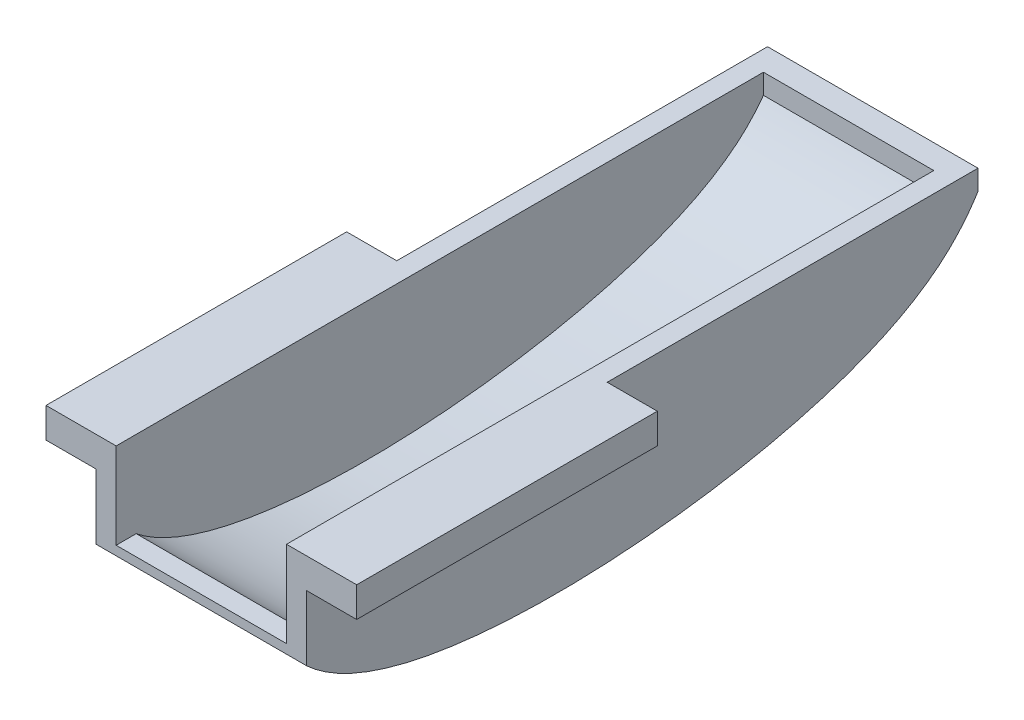
ISO-10303-21;
HEADER;
FILE_DESCRIPTION(('STEP AP214'),'2;1');
FILE_NAME('part.step','',(''),(''),'','','');
FILE_SCHEMA(('AUTOMOTIVE_DESIGN { 1 0 10303 214 1 1 1 1 }'));
ENDSEC;
DATA;
#1=APPLICATION_CONTEXT('core data for automotive mechanical design processes');
#2=APPLICATION_PROTOCOL_DEFINITION('international standard','automotive_design',2000,#1);
#3=PRODUCT_CONTEXT('',#1,'mechanical');
#4=PRODUCT('Part','Part','',(#3));
#5=PRODUCT_RELATED_PRODUCT_CATEGORY('part','',(#4));
#6=PRODUCT_DEFINITION_FORMATION('','',#4);
#7=PRODUCT_DEFINITION_CONTEXT('part definition',#1,'design');
#8=PRODUCT_DEFINITION('design','',#6,#7);
#9=PRODUCT_DEFINITION_SHAPE('','',#8);
#10=(LENGTH_UNIT() NAMED_UNIT(*) SI_UNIT(.MILLI.,.METRE.));
#11=(NAMED_UNIT(*) PLANE_ANGLE_UNIT() SI_UNIT($,.RADIAN.));
#12=(NAMED_UNIT(*) SI_UNIT($,.STERADIAN.) SOLID_ANGLE_UNIT());
#13=UNCERTAINTY_MEASURE_WITH_UNIT(LENGTH_MEASURE(1.E-05),#10,'distance_accuracy_value','');
#14=(GEOMETRIC_REPRESENTATION_CONTEXT(3) GLOBAL_UNCERTAINTY_ASSIGNED_CONTEXT((#13)) GLOBAL_UNIT_ASSIGNED_CONTEXT((#10,
#11,#12)) REPRESENTATION_CONTEXT('',''));
#15=CARTESIAN_POINT('',(0.,0.,0.));
#16=DIRECTION('',(0.,0.,1.));
#17=DIRECTION('',(1.,0.,0.));
#18=AXIS2_PLACEMENT_3D('',#15,#16,#17);
#19=CARTESIAN_POINT('',(10.5,-13.046875,30.375));
#20=DIRECTION('',(1.,0.,0.));
#21=DIRECTION('',(0.,0.,-1.));
#22=AXIS2_PLACEMENT_3D('',#19,#20,#21);
#23=PLANE('',#22);
#24=DIRECTION('',(0.,0.,1.));
#25=VECTOR('',#24,1.);
#26=CARTESIAN_POINT('',(10.5,2.00000000000028,2.40991752715528));
#27=LINE('',#26,#25);
#28=CARTESIAN_POINT('',(10.5,2.00000000000028,0.));
#29=VERTEX_POINT('',#28);
#30=CARTESIAN_POINT('',(10.5,2.00000000000028,37.));
#31=VERTEX_POINT('',#30);
#32=EDGE_CURVE('E162',#29,#31,#27,.T.);
#33=ORIENTED_EDGE('',*,*,#32,.T.);
#34=DIRECTION('',(0.,-1.,0.));
#35=VECTOR('',#34,1.);
#36=CARTESIAN_POINT('',(10.5,-0.999999999999722,37.));
#37=LINE('',#36,#35);
#38=CARTESIAN_POINT('',(10.5,-0.999999999999722,37.));
#39=VERTEX_POINT('',#38);
#40=EDGE_CURVE('E154',#31,#39,#37,.T.);
#41=ORIENTED_EDGE('',*,*,#40,.T.);
#42=DIRECTION('',(0.,0.,1.));
#43=VECTOR('',#42,1.);
#44=CARTESIAN_POINT('',(10.5,-0.999999999999722,37.));
#45=LINE('',#44,#43);
#46=CARTESIAN_POINT('',(10.5,-0.999999999999722,67.));
#47=VERTEX_POINT('',#46);
#48=EDGE_CURVE('E140',#39,#47,#45,.T.);
#49=ORIENTED_EDGE('',*,*,#48,.T.);
#50=DIRECTION('',(0.,-1.,0.));
#51=VECTOR('',#50,1.);
#52=CARTESIAN_POINT('',(10.5,-7.5,67.));
#53=LINE('',#52,#51);
#54=CARTESIAN_POINT('',(10.5,-7.5,67.));
#55=VERTEX_POINT('',#54);
#56=EDGE_CURVE('E246',#47,#55,#53,.T.);
#57=ORIENTED_EDGE('',*,*,#56,.T.);
#58=CARTESIAN_POINT('',(10.5,-7.5,67.));
#59=CARTESIAN_POINT('',(10.5,-14.,60.));
#60=CARTESIAN_POINT('',(10.5,-17.,44.));
#61=CARTESIAN_POINT('',(10.5,-13.,14.));
#62=CARTESIAN_POINT('',(10.5,-8.,5.));
#63=CARTESIAN_POINT('',(10.5,0.,0.));
#64=B_SPLINE_CURVE_WITH_KNOTS('',5,(#58,#59,#60,#61,#62,#63),.UNSPECIFIED.,.F.,.F.,(6,6),(0.,
1.),.UNSPECIFIED.);
#65=CARTESIAN_POINT('',(10.5,0.,0.));
#66=VERTEX_POINT('',#65);
#67=EDGE_CURVE('E235',#55,#66,#64,.T.);
#68=ORIENTED_EDGE('',*,*,#67,.T.);
#69=DIRECTION('',(0.,1.,0.));
#70=VECTOR('',#69,1.);
#71=CARTESIAN_POINT('',(10.5,2.00000000000028,0.));
#72=LINE('',#71,#70);
#73=EDGE_CURVE('E240',#66,#29,#72,.T.);
#74=ORIENTED_EDGE('',*,*,#73,.T.);
#75=EDGE_LOOP('',(#33,#41,#49,#57,#68,#74));
#76=FACE_BOUND('',#75,.T.);
#77=ADVANCED_FACE('F32',(#76),#23,.T.);
#78=CARTESIAN_POINT('',(-10.5,-13.046875,30.375));
#79=DIRECTION('',(1.,0.,0.));
#80=DIRECTION('',(0.,0.,-1.));
#81=AXIS2_PLACEMENT_3D('',#78,#79,#80);
#82=PLANE('',#81);
#83=DIRECTION('',(0.,0.,1.));
#84=VECTOR('',#83,1.);
#85=CARTESIAN_POINT('',(-10.5,-0.999999999999724,37.));
#86=LINE('',#85,#84);
#87=CARTESIAN_POINT('',(-10.5,-0.999999999999724,37.));
#88=VERTEX_POINT('',#87);
#89=CARTESIAN_POINT('',(-10.5,-0.999999999999724,67.));
#90=VERTEX_POINT('',#89);
#91=EDGE_CURVE('E191',#88,#90,#86,.T.);
#92=ORIENTED_EDGE('',*,*,#91,.F.);
#93=DIRECTION('',(0.,1.,0.));
#94=VECTOR('',#93,1.);
#95=CARTESIAN_POINT('',(-10.5,2.00000000000028,37.));
#96=LINE('',#95,#94);
#97=CARTESIAN_POINT('',(-10.5,2.00000000000028,37.));
#98=VERTEX_POINT('',#97);
#99=EDGE_CURVE('E176',#88,#98,#96,.T.);
#100=ORIENTED_EDGE('',*,*,#99,.T.);
#101=DIRECTION('',(0.,0.,1.));
#102=VECTOR('',#101,1.);
#103=CARTESIAN_POINT('',(-10.5,2.00000000000028,2.40991752715528));
#104=LINE('',#103,#102);
#105=CARTESIAN_POINT('',(-10.5,2.00000000000028,0.));
#106=VERTEX_POINT('',#105);
#107=EDGE_CURVE('E259',#106,#98,#104,.T.);
#108=ORIENTED_EDGE('',*,*,#107,.F.);
#109=DIRECTION('',(0.,1.,0.));
#110=VECTOR('',#109,1.);
#111=CARTESIAN_POINT('',(-10.5,2.00000000000028,0.));
#112=LINE('',#111,#110);
#113=CARTESIAN_POINT('',(-10.5,0.,0.));
#114=VERTEX_POINT('',#113);
#115=EDGE_CURVE('E253',#114,#106,#112,.T.);
#116=ORIENTED_EDGE('',*,*,#115,.F.);
#117=CARTESIAN_POINT('',(-10.5,-7.5,67.));
#118=CARTESIAN_POINT('',(-10.5,-14.,60.));
#119=CARTESIAN_POINT('',(-10.5,-17.,44.));
#120=CARTESIAN_POINT('',(-10.5,-13.,14.));
#121=CARTESIAN_POINT('',(-10.5,-8.,5.));
#122=CARTESIAN_POINT('',(-10.5,0.,0.));
#123=B_SPLINE_CURVE_WITH_KNOTS('',5,(#117,#118,#119,#120,#121,#122),.UNSPECIFIED.,.F.,.F.,(6,6),
(0.,1.),.UNSPECIFIED.);
#124=CARTESIAN_POINT('',(-10.5,-7.5,67.));
#125=VERTEX_POINT('',#124);
#126=EDGE_CURVE('E247',#125,#114,#123,.T.);
#127=ORIENTED_EDGE('',*,*,#126,.F.);
#128=DIRECTION('',(0.,-1.,0.));
#129=VECTOR('',#128,1.);
#130=CARTESIAN_POINT('',(-10.5,-7.5,67.));
#131=LINE('',#130,#129);
#132=EDGE_CURVE('E262',#90,#125,#131,.T.);
#133=ORIENTED_EDGE('',*,*,#132,.F.);
#134=EDGE_LOOP('',(#92,#100,#108,#116,#127,#133));
#135=FACE_BOUND('',#134,.T.);
#136=ADVANCED_FACE('F298',(#135),#82,.F.);
#137=CARTESIAN_POINT('',(-10.5,-6.58541733028586,65.));
#138=DIRECTION('',(0.,1.,0.));
#139=DIRECTION('',(0.,0.,1.));
#140=AXIS2_PLACEMENT_3D('',#137,#138,#139);
#141=PLANE('',#140);
#142=DIRECTION('',(1.,0.,0.));
#143=VECTOR('',#142,1.);
#144=CARTESIAN_POINT('',(-10.5,-6.58541733028586,67.));
#145=LINE('',#144,#143);
#146=CARTESIAN_POINT('',(-8.5,-6.58541733028586,67.));
#147=VERTEX_POINT('',#146);
#148=CARTESIAN_POINT('',(8.5,-6.58541733028586,67.));
#149=VERTEX_POINT('',#148);
#150=EDGE_CURVE('E42',#147,#149,#145,.T.);
#151=ORIENTED_EDGE('',*,*,#150,.T.);
#152=DIRECTION('',(0.,0.,-1.));
#153=VECTOR('',#152,1.);
#154=CARTESIAN_POINT('',(8.5,-6.58541733028586,65.));
#155=LINE('',#154,#153);
#156=CARTESIAN_POINT('',(8.49999999999999,-6.58541733028586,65.));
#157=VERTEX_POINT('',#156);
#158=EDGE_CURVE('E211',#149,#157,#155,.T.);
#159=ORIENTED_EDGE('',*,*,#158,.T.);
#160=DIRECTION('',(1.,0.,0.));
#161=VECTOR('',#160,1.);
#162=CARTESIAN_POINT('',(-10.5,-6.58541733028586,65.));
#163=LINE('',#162,#161);
#164=CARTESIAN_POINT('',(-8.5,-6.58541733028586,65.));
#165=VERTEX_POINT('',#164);
#166=EDGE_CURVE('E329',#165,#157,#163,.T.);
#167=ORIENTED_EDGE('',*,*,#166,.F.);
#168=DIRECTION('',(0.,0.,1.));
#169=VECTOR('',#168,1.);
#170=CARTESIAN_POINT('',(-8.5,-6.58541733028586,65.));
#171=LINE('',#170,#169);
#172=EDGE_CURVE('E230',#165,#147,#171,.T.);
#173=ORIENTED_EDGE('',*,*,#172,.T.);
#174=EDGE_LOOP('',(#151,#159,#167,#173));
#175=FACE_BOUND('',#174,.T.);
#176=ADVANCED_FACE('F276',(#175),#141,.T.);
#177=CARTESIAN_POINT('',(-10.5,1.05969013823158,1.69556016571188));
#178=CARTESIAN_POINT('',(-10.5,0.326468374083647,2.15382949062016));
#179=CARTESIAN_POINT('',(-10.5,-1.06829617807532,3.16044090071315));
#180=CARTESIAN_POINT('',(-10.5,-3.57411888475472,5.718312008346));
#181=CARTESIAN_POINT('',(-10.5,-6.43576100075407,10.4976857034237));
#182=CARTESIAN_POINT('',(-10.5,-9.23382079752525,19.0374388766017));
#183=CARTESIAN_POINT('',(-10.5,-11.1364315280221,29.5720475329086));
#184=CARTESIAN_POINT('',(-10.5,-11.7993859953844,38.9666765556865));
#185=CARTESIAN_POINT('',(-10.5,-11.6937557642379,46.135832890669));
#186=CARTESIAN_POINT('',(-10.5,-11.2863118300239,51.1667034980007));
#187=CARTESIAN_POINT('',(-10.5,-10.5490344311225,55.693282116091));
#188=CARTESIAN_POINT('',(-10.5,-9.67188280200554,58.9320013956317));
#189=CARTESIAN_POINT('',(-10.5,-8.82973839544355,61.1570857059076));
#190=CARTESIAN_POINT('',(-10.5,-8.13783828860439,62.6339101824341));
#191=CARTESIAN_POINT('',(-10.5,-7.38227890242257,63.9314616852654));
#192=CARTESIAN_POINT('',(-10.5,-6.86938762757851,64.6457710080204));
#193=CARTESIAN_POINT('',(-10.5,-6.58541733028586,65.));
#194=B_SPLINE_CURVE_WITH_KNOTS('',3,(#177,#178,#179,#180,#181,#182,#183,#184,#185,#186,#187,
#188,#189,#190,#191,#192,#193),.UNSPECIFIED.,.F.,.F.,(4,1,1,1,1,1,1,1,1,1,1,1,1,1,4),(0.,
0.0612295232460904,0.122459046492181,0.244918092984361,0.367377139476542,0.489836185968723,
0.612295232460904,0.673524755706994,0.734754278953084,0.795983802199175,0.857213325445265,
0.88782808706831,0.918442848691355,0.949057610314401,0.979672371937446),.UNSPECIFIED.);
#195=DIRECTION('',(1.,0.,0.));
#196=VECTOR('',#195,1.);
#197=SURFACE_OF_LINEAR_EXTRUSION('',#194,#196);
#198=ORIENTED_EDGE('',*,*,#166,.T.);
#199=CARTESIAN_POINT('',(8.49999999999999,1.05969013823158,1.69556016571188));
#200=CARTESIAN_POINT('',(8.49999999999999,0.326468374083647,2.15382949062016));
#201=CARTESIAN_POINT('',(8.49999999999999,-1.06829617807532,3.16044090071315));
#202=CARTESIAN_POINT('',(8.49999999999999,-3.57411888475472,5.718312008346));
#203=CARTESIAN_POINT('',(8.49999999999999,-6.43576100075407,10.4976857034237));
#204=CARTESIAN_POINT('',(8.49999999999999,-9.23382079752525,19.0374388766017));
#205=CARTESIAN_POINT('',(8.49999999999999,-11.1364315280221,29.5720475329086));
#206=CARTESIAN_POINT('',(8.49999999999999,-11.7993859953844,38.9666765556865));
#207=CARTESIAN_POINT('',(8.49999999999999,-11.6937557642379,46.135832890669));
#208=CARTESIAN_POINT('',(8.49999999999999,-11.2863118300239,51.1667034980007));
#209=CARTESIAN_POINT('',(8.49999999999999,-10.5490344311225,55.693282116091));
#210=CARTESIAN_POINT('',(8.49999999999999,-9.67188280200554,58.9320013956317));
#211=CARTESIAN_POINT('',(8.49999999999999,-8.82973839544355,61.1570857059076));
#212=CARTESIAN_POINT('',(8.49999999999999,-8.13783828860439,62.6339101824341));
#213=CARTESIAN_POINT('',(8.49999999999999,-7.38227890242257,63.9314616852654));
#214=CARTESIAN_POINT('',(8.49999999999999,-6.86938762757851,64.6457710080204));
#215=CARTESIAN_POINT('',(8.49999999999999,-6.58541733028586,65.));
#216=B_SPLINE_CURVE_WITH_KNOTS('',3,(#199,#200,#201,#202,#203,#204,#205,#206,#207,#208,#209,
#210,#211,#212,#213,#214,#215),.UNSPECIFIED.,.F.,.F.,(4,1,1,1,1,1,1,1,1,1,1,1,1,1,4),(0.,
0.0612295232460904,0.122459046492181,0.244918092984361,0.367377139476542,0.489836185968723,
0.612295232460904,0.673524755706994,0.734754278953084,0.795983802199175,0.857213325445265,
0.88782808706831,0.918442848691355,0.949057610314401,0.979672371937446),.UNSPECIFIED.);
#217=CARTESIAN_POINT('',(8.5,0.,2.40991752715547));
#218=VERTEX_POINT('',#217);
#219=EDGE_CURVE('E206',#157,#218,#216,.F.);
#220=ORIENTED_EDGE('',*,*,#219,.T.);
#221=DIRECTION('',(1.,0.,0.));
#222=VECTOR('',#221,1.);
#223=CARTESIAN_POINT('',(-10.5,0.,2.40991752715547));
#224=LINE('',#223,#222);
#225=CARTESIAN_POINT('',(-8.5,0.,2.40991752715547));
#226=VERTEX_POINT('',#225);
#227=EDGE_CURVE('E322',#226,#218,#224,.T.);
#228=ORIENTED_EDGE('',*,*,#227,.F.);
#229=CARTESIAN_POINT('',(-8.5,1.05969013823158,1.69556016571188));
#230=CARTESIAN_POINT('',(-8.5,0.326468374083647,2.15382949062016));
#231=CARTESIAN_POINT('',(-8.5,-1.06829617807532,3.16044090071315));
#232=CARTESIAN_POINT('',(-8.5,-3.57411888475472,5.718312008346));
#233=CARTESIAN_POINT('',(-8.5,-6.43576100075407,10.4976857034237));
#234=CARTESIAN_POINT('',(-8.5,-9.23382079752525,19.0374388766017));
#235=CARTESIAN_POINT('',(-8.5,-11.1364315280221,29.5720475329086));
#236=CARTESIAN_POINT('',(-8.5,-11.7993859953844,38.9666765556865));
#237=CARTESIAN_POINT('',(-8.5,-11.6937557642379,46.135832890669));
#238=CARTESIAN_POINT('',(-8.5,-11.2863118300239,51.1667034980007));
#239=CARTESIAN_POINT('',(-8.5,-10.5490344311225,55.693282116091));
#240=CARTESIAN_POINT('',(-8.5,-9.67188280200554,58.9320013956317));
#241=CARTESIAN_POINT('',(-8.5,-8.82973839544355,61.1570857059076));
#242=CARTESIAN_POINT('',(-8.5,-8.13783828860439,62.6339101824341));
#243=CARTESIAN_POINT('',(-8.5,-7.38227890242257,63.9314616852654));
#244=CARTESIAN_POINT('',(-8.5,-6.86938762757851,64.6457710080204));
#245=CARTESIAN_POINT('',(-8.5,-6.58541733028586,65.));
#246=B_SPLINE_CURVE_WITH_KNOTS('',3,(#229,#230,#231,#232,#233,#234,#235,#236,#237,#238,#239,
#240,#241,#242,#243,#244,#245),.UNSPECIFIED.,.F.,.F.,(4,1,1,1,1,1,1,1,1,1,1,1,1,1,4),(0.,
0.0612295232460904,0.122459046492181,0.244918092984361,0.367377139476542,0.489836185968723,
0.612295232460904,0.673524755706994,0.734754278953084,0.795983802199175,0.857213325445265,
0.88782808706831,0.918442848691355,0.949057610314401,0.979672371937446),.UNSPECIFIED.);
#247=EDGE_CURVE('E226',#226,#165,#246,.T.);
#248=ORIENTED_EDGE('',*,*,#247,.T.);
#249=EDGE_LOOP('',(#198,#220,#228,#248));
#250=FACE_BOUND('',#249,.T.);
#251=ADVANCED_FACE('F271',(#250),#197,.T.);
#252=CARTESIAN_POINT('',(-10.5,0.,2.40991752715547));
#253=DIRECTION('',(0.,0.,1.));
#254=DIRECTION('',(0.,-1.,0.));
#255=AXIS2_PLACEMENT_3D('',#252,#253,#254);
#256=PLANE('',#255);
#257=ORIENTED_EDGE('',*,*,#227,.T.);
#258=DIRECTION('',(0.,1.,0.));
#259=VECTOR('',#258,1.);
#260=CARTESIAN_POINT('',(8.5,0.,2.40991752715547));
#261=LINE('',#260,#259);
#262=CARTESIAN_POINT('',(8.5,2.00000000000028,2.40991752715528));
#263=VERTEX_POINT('',#262);
#264=EDGE_CURVE('E203',#218,#263,#261,.T.);
#265=ORIENTED_EDGE('',*,*,#264,.T.);
#266=DIRECTION('',(1.,0.,0.));
#267=VECTOR('',#266,1.);
#268=CARTESIAN_POINT('',(-10.5,2.00000000000028,2.40991752715528));
#269=LINE('',#268,#267);
#270=CARTESIAN_POINT('',(-8.5,2.00000000000028,2.40991752715528));
#271=VERTEX_POINT('',#270);
#272=EDGE_CURVE('E319',#271,#263,#269,.T.);
#273=ORIENTED_EDGE('',*,*,#272,.F.);
#274=DIRECTION('',(0.,-1.,0.));
#275=VECTOR('',#274,1.);
#276=CARTESIAN_POINT('',(-8.5,0.,2.40991752715547));
#277=LINE('',#276,#275);
#278=EDGE_CURVE('E224',#271,#226,#277,.T.);
#279=ORIENTED_EDGE('',*,*,#278,.T.);
#280=EDGE_LOOP('',(#257,#265,#273,#279));
#281=FACE_BOUND('',#280,.T.);
#282=ADVANCED_FACE('F275',(#281),#256,.T.);
#283=DIRECTION('',(1.,0.,0.));
#284=VECTOR('',#283,1.);
#285=SURFACE_OF_LINEAR_EXTRUSION('',#123,#284);
#286=ORIENTED_EDGE('',*,*,#67,.F.);
#287=DIRECTION('',(1.,0.,0.));
#288=VECTOR('',#287,1.);
#289=CARTESIAN_POINT('',(-10.5,-7.5,67.));
#290=LINE('',#289,#288);
#291=EDGE_CURVE('E11',#125,#55,#290,.T.);
#292=ORIENTED_EDGE('',*,*,#291,.F.);
#293=ORIENTED_EDGE('',*,*,#126,.T.);
#294=DIRECTION('',(1.,0.,0.));
#295=VECTOR('',#294,1.);
#296=CARTESIAN_POINT('',(-10.5,0.,0.));
#297=LINE('',#296,#295);
#298=EDGE_CURVE('E315',#114,#66,#297,.T.);
#299=ORIENTED_EDGE('',*,*,#298,.T.);
#300=EDGE_LOOP('',(#286,#292,#293,#299));
#301=FACE_BOUND('',#300,.T.);
#302=ADVANCED_FACE('F34',(#301),#285,.T.);
#303=CARTESIAN_POINT('',(-10.5,-7.5,67.));
#304=DIRECTION('',(0.,0.,1.));
#305=DIRECTION('',(1.,0.,0.));
#306=AXIS2_PLACEMENT_3D('',#303,#304,#305);
#307=PLANE('',#306);
#308=ORIENTED_EDGE('',*,*,#56,.F.);
#309=DIRECTION('',(1.,0.,0.));
#310=VECTOR('',#309,1.);
#311=CARTESIAN_POINT('',(10.5,-0.999999999999722,67.));
#312=LINE('',#311,#310);
#313=CARTESIAN_POINT('',(15.5,-0.999999999999721,67.));
#314=VERTEX_POINT('',#313);
#315=EDGE_CURVE('E49',#47,#314,#312,.T.);
#316=ORIENTED_EDGE('',*,*,#315,.T.);
#317=DIRECTION('',(0.,1.,0.));
#318=VECTOR('',#317,1.);
#319=CARTESIAN_POINT('',(15.5,-0.999999999999721,67.));
#320=LINE('',#319,#318);
#321=CARTESIAN_POINT('',(15.5,2.00000000000028,67.));
#322=VERTEX_POINT('',#321);
#323=EDGE_CURVE('E163',#314,#322,#320,.T.);
#324=ORIENTED_EDGE('',*,*,#323,.T.);
#325=DIRECTION('',(1.,0.,0.));
#326=VECTOR('',#325,1.);
#327=CARTESIAN_POINT('',(8.5,2.00000000000028,67.));
#328=LINE('',#327,#326);
#329=CARTESIAN_POINT('',(8.5,2.00000000000028,67.));
#330=VERTEX_POINT('',#329);
#331=EDGE_CURVE('E201',#330,#322,#328,.T.);
#332=ORIENTED_EDGE('',*,*,#331,.F.);
#333=DIRECTION('',(0.,1.,0.));
#334=VECTOR('',#333,1.);
#335=CARTESIAN_POINT('',(8.5,-7.5,67.));
#336=LINE('',#335,#334);
#337=EDGE_CURVE('E199',#149,#330,#336,.T.);
#338=ORIENTED_EDGE('',*,*,#337,.F.);
#339=ORIENTED_EDGE('',*,*,#150,.F.);
#340=DIRECTION('',(0.,1.,0.));
#341=VECTOR('',#340,1.);
#342=CARTESIAN_POINT('',(-8.5,-7.5,67.));
#343=LINE('',#342,#341);
#344=CARTESIAN_POINT('',(-8.5,2.00000000000028,67.));
#345=VERTEX_POINT('',#344);
#346=EDGE_CURVE('E217',#147,#345,#343,.T.);
#347=ORIENTED_EDGE('',*,*,#346,.T.);
#348=DIRECTION('',(-1.,0.,0.));
#349=VECTOR('',#348,1.);
#350=CARTESIAN_POINT('',(-8.5,2.00000000000028,67.));
#351=LINE('',#350,#349);
#352=CARTESIAN_POINT('',(-15.5,2.00000000000028,67.));
#353=VERTEX_POINT('',#352);
#354=EDGE_CURVE('E222',#345,#353,#351,.T.);
#355=ORIENTED_EDGE('',*,*,#354,.T.);
#356=DIRECTION('',(0.,-1.,0.));
#357=VECTOR('',#356,1.);
#358=CARTESIAN_POINT('',(-15.5,2.00000000000028,67.));
#359=LINE('',#358,#357);
#360=CARTESIAN_POINT('',(-15.5,-0.999999999999725,67.));
#361=VERTEX_POINT('',#360);
#362=EDGE_CURVE('E174',#353,#361,#359,.T.);
#363=ORIENTED_EDGE('',*,*,#362,.T.);
#364=DIRECTION('',(1.,0.,0.));
#365=VECTOR('',#364,1.);
#366=CARTESIAN_POINT('',(-10.5,-0.999999999999724,67.));
#367=LINE('',#366,#365);
#368=EDGE_CURVE('E178',#361,#90,#367,.T.);
#369=ORIENTED_EDGE('',*,*,#368,.T.);
#370=ORIENTED_EDGE('',*,*,#132,.T.);
#371=ORIENTED_EDGE('',*,*,#291,.T.);
#372=EDGE_LOOP('',(#308,#316,#324,#332,#338,#339,#347,#355,#363,#369,#370,#371));
#373=FACE_BOUND('',#372,.T.);
#374=ADVANCED_FACE('F285',(#373),#307,.T.);
#375=CARTESIAN_POINT('',(-10.5,2.00000000000028,2.40991752715528));
#376=DIRECTION('',(0.,1.,0.));
#377=DIRECTION('',(0.,0.,1.));
#378=AXIS2_PLACEMENT_3D('',#375,#376,#377);
#379=PLANE('',#378);
#380=ORIENTED_EDGE('',*,*,#32,.F.);
#381=DIRECTION('',(1.,0.,0.));
#382=VECTOR('',#381,1.);
#383=CARTESIAN_POINT('',(-10.5,2.00000000000028,0.));
#384=LINE('',#383,#382);
#385=EDGE_CURVE('E317',#106,#29,#384,.T.);
#386=ORIENTED_EDGE('',*,*,#385,.F.);
#387=ORIENTED_EDGE('',*,*,#107,.T.);
#388=DIRECTION('',(-1.,0.,0.));
#389=VECTOR('',#388,1.);
#390=CARTESIAN_POINT('',(-10.5,2.00000000000028,37.));
#391=LINE('',#390,#389);
#392=CARTESIAN_POINT('',(-15.5,2.00000000000028,37.));
#393=VERTEX_POINT('',#392);
#394=EDGE_CURVE('E57',#98,#393,#391,.T.);
#395=ORIENTED_EDGE('',*,*,#394,.T.);
#396=DIRECTION('',(0.,0.,1.));
#397=VECTOR('',#396,1.);
#398=CARTESIAN_POINT('',(-15.5,2.00000000000028,37.));
#399=LINE('',#398,#397);
#400=EDGE_CURVE('E186',#393,#353,#399,.T.);
#401=ORIENTED_EDGE('',*,*,#400,.T.);
#402=ORIENTED_EDGE('',*,*,#354,.F.);
#403=DIRECTION('',(0.,0.,-1.));
#404=VECTOR('',#403,1.);
#405=CARTESIAN_POINT('',(-8.5,2.00000000000028,0.));
#406=LINE('',#405,#404);
#407=EDGE_CURVE('E219',#345,#271,#406,.T.);
#408=ORIENTED_EDGE('',*,*,#407,.T.);
#409=ORIENTED_EDGE('',*,*,#272,.T.);
#410=DIRECTION('',(0.,0.,-1.));
#411=VECTOR('',#410,1.);
#412=CARTESIAN_POINT('',(8.5,2.00000000000028,0.));
#413=LINE('',#412,#411);
#414=EDGE_CURVE('E193',#330,#263,#413,.T.);
#415=ORIENTED_EDGE('',*,*,#414,.F.);
#416=ORIENTED_EDGE('',*,*,#331,.T.);
#417=DIRECTION('',(0.,0.,1.));
#418=VECTOR('',#417,1.);
#419=CARTESIAN_POINT('',(15.5,2.00000000000028,37.));
#420=LINE('',#419,#418);
#421=CARTESIAN_POINT('',(15.5,2.00000000000028,37.));
#422=VERTEX_POINT('',#421);
#423=EDGE_CURVE('E171',#422,#322,#420,.T.);
#424=ORIENTED_EDGE('',*,*,#423,.F.);
#425=DIRECTION('',(-1.,0.,0.));
#426=VECTOR('',#425,1.);
#427=CARTESIAN_POINT('',(10.5,2.00000000000028,37.));
#428=LINE('',#427,#426);
#429=EDGE_CURVE('E148',#422,#31,#428,.T.);
#430=ORIENTED_EDGE('',*,*,#429,.T.);
#431=EDGE_LOOP('',(#380,#386,#387,#395,#401,#402,#408,#409,#415,#416,#424,#430));
#432=FACE_BOUND('',#431,.T.);
#433=ADVANCED_FACE('F282',(#432),#379,.T.);
#434=CARTESIAN_POINT('',(-10.5,2.00000000000028,0.));
#435=DIRECTION('',(0.,0.,-1.));
#436=DIRECTION('',(-1.,0.,0.));
#437=AXIS2_PLACEMENT_3D('',#434,#435,#436);
#438=PLANE('',#437);
#439=ORIENTED_EDGE('',*,*,#73,.F.);
#440=ORIENTED_EDGE('',*,*,#298,.F.);
#441=ORIENTED_EDGE('',*,*,#115,.T.);
#442=ORIENTED_EDGE('',*,*,#385,.T.);
#443=EDGE_LOOP('',(#439,#440,#441,#442));
#444=FACE_BOUND('',#443,.T.);
#445=ADVANCED_FACE('F284',(#444),#438,.T.);
#446=CARTESIAN_POINT('',(-8.5,-13.046875,30.375));
#447=DIRECTION('',(-1.,0.,0.));
#448=DIRECTION('',(0.,0.,1.));
#449=AXIS2_PLACEMENT_3D('',#446,#447,#448);
#450=PLANE('',#449);
#451=ORIENTED_EDGE('',*,*,#172,.F.);
#452=ORIENTED_EDGE('',*,*,#247,.F.);
#453=ORIENTED_EDGE('',*,*,#278,.F.);
#454=ORIENTED_EDGE('',*,*,#407,.F.);
#455=ORIENTED_EDGE('',*,*,#346,.F.);
#456=EDGE_LOOP('',(#451,#452,#453,#454,#455));
#457=FACE_BOUND('',#456,.T.);
#458=ADVANCED_FACE('F288',(#457),#450,.F.);
#459=CARTESIAN_POINT('',(8.5,-13.046875,30.375));
#460=DIRECTION('',(1.,0.,0.));
#461=DIRECTION('',(0.,0.,1.));
#462=AXIS2_PLACEMENT_3D('',#459,#460,#461);
#463=PLANE('',#462);
#464=ORIENTED_EDGE('',*,*,#158,.F.);
#465=ORIENTED_EDGE('',*,*,#337,.T.);
#466=ORIENTED_EDGE('',*,*,#414,.T.);
#467=ORIENTED_EDGE('',*,*,#264,.F.);
#468=ORIENTED_EDGE('',*,*,#219,.F.);
#469=EDGE_LOOP('',(#464,#465,#466,#467,#468));
#470=FACE_BOUND('',#469,.T.);
#471=ADVANCED_FACE('F293',(#470),#463,.F.);
#472=CARTESIAN_POINT('',(-10.5,-0.999999999999724,37.));
#473=DIRECTION('',(0.,-1.,0.));
#474=DIRECTION('',(1.,0.,0.));
#475=AXIS2_PLACEMENT_3D('',#472,#473,#474);
#476=PLANE('',#475);
#477=ORIENTED_EDGE('',*,*,#368,.F.);
#478=DIRECTION('',(0.,0.,1.));
#479=VECTOR('',#478,1.);
#480=CARTESIAN_POINT('',(-15.5,-0.999999999999725,37.));
#481=LINE('',#480,#479);
#482=CARTESIAN_POINT('',(-15.5,-0.999999999999725,37.));
#483=VERTEX_POINT('',#482);
#484=EDGE_CURVE('E194',#483,#361,#481,.T.);
#485=ORIENTED_EDGE('',*,*,#484,.F.);
#486=DIRECTION('',(1.,0.,0.));
#487=VECTOR('',#486,1.);
#488=CARTESIAN_POINT('',(-10.5,-0.999999999999724,37.));
#489=LINE('',#488,#487);
#490=EDGE_CURVE('E183',#483,#88,#489,.T.);
#491=ORIENTED_EDGE('',*,*,#490,.T.);
#492=ORIENTED_EDGE('',*,*,#91,.T.);
#493=EDGE_LOOP('',(#477,#485,#491,#492));
#494=FACE_BOUND('',#493,.T.);
#495=ADVANCED_FACE('F351',(#494),#476,.T.);
#496=CARTESIAN_POINT('',(-15.5,2.00000000000028,37.));
#497=DIRECTION('',(-1.,0.,0.));
#498=DIRECTION('',(0.,0.,1.));
#499=AXIS2_PLACEMENT_3D('',#496,#497,#498);
#500=PLANE('',#499);
#501=ORIENTED_EDGE('',*,*,#362,.F.);
#502=ORIENTED_EDGE('',*,*,#400,.F.);
#503=DIRECTION('',(0.,-1.,0.));
#504=VECTOR('',#503,1.);
#505=CARTESIAN_POINT('',(-15.5,2.00000000000028,37.));
#506=LINE('',#505,#504);
#507=EDGE_CURVE('E180',#393,#483,#506,.T.);
#508=ORIENTED_EDGE('',*,*,#507,.T.);
#509=ORIENTED_EDGE('',*,*,#484,.T.);
#510=EDGE_LOOP('',(#501,#502,#508,#509));
#511=FACE_BOUND('',#510,.T.);
#512=ADVANCED_FACE('F355',(#511),#500,.T.);
#513=CARTESIAN_POINT('',(0.,0.,37.));
#514=DIRECTION('',(0.,0.,-1.));
#515=DIRECTION('',(-1.,0.,0.));
#516=AXIS2_PLACEMENT_3D('',#513,#514,#515);
#517=PLANE('',#516);
#518=ORIENTED_EDGE('',*,*,#99,.F.);
#519=ORIENTED_EDGE('',*,*,#490,.F.);
#520=ORIENTED_EDGE('',*,*,#507,.F.);
#521=ORIENTED_EDGE('',*,*,#394,.F.);
#522=EDGE_LOOP('',(#518,#519,#520,#521));
#523=FACE_BOUND('',#522,.T.);
#524=ADVANCED_FACE('F354',(#523),#517,.T.);
#525=CARTESIAN_POINT('',(15.5,-0.999999999999721,37.));
#526=DIRECTION('',(1.,0.,0.));
#527=DIRECTION('',(0.,0.,-1.));
#528=AXIS2_PLACEMENT_3D('',#525,#526,#527);
#529=PLANE('',#528);
#530=ORIENTED_EDGE('',*,*,#323,.F.);
#531=DIRECTION('',(0.,0.,1.));
#532=VECTOR('',#531,1.);
#533=CARTESIAN_POINT('',(15.5,-0.999999999999721,37.));
#534=LINE('',#533,#532);
#535=CARTESIAN_POINT('',(15.5,-0.999999999999721,37.));
#536=VERTEX_POINT('',#535);
#537=EDGE_CURVE('E147',#536,#314,#534,.T.);
#538=ORIENTED_EDGE('',*,*,#537,.F.);
#539=DIRECTION('',(0.,1.,0.));
#540=VECTOR('',#539,1.);
#541=CARTESIAN_POINT('',(15.5,-0.999999999999721,37.));
#542=LINE('',#541,#540);
#543=EDGE_CURVE('E157',#536,#422,#542,.T.);
#544=ORIENTED_EDGE('',*,*,#543,.T.);
#545=ORIENTED_EDGE('',*,*,#423,.T.);
#546=EDGE_LOOP('',(#530,#538,#544,#545));
#547=FACE_BOUND('',#546,.T.);
#548=ADVANCED_FACE('F362',(#547),#529,.T.);
#549=CARTESIAN_POINT('',(10.5,-0.999999999999722,37.));
#550=DIRECTION('',(0.,-1.,0.));
#551=DIRECTION('',(1.,0.,0.));
#552=AXIS2_PLACEMENT_3D('',#549,#550,#551);
#553=PLANE('',#552);
#554=ORIENTED_EDGE('',*,*,#315,.F.);
#555=ORIENTED_EDGE('',*,*,#48,.F.);
#556=DIRECTION('',(1.,0.,0.));
#557=VECTOR('',#556,1.);
#558=CARTESIAN_POINT('',(10.5,-0.999999999999722,37.));
#559=LINE('',#558,#557);
#560=EDGE_CURVE('E143',#39,#536,#559,.T.);
#561=ORIENTED_EDGE('',*,*,#560,.T.);
#562=ORIENTED_EDGE('',*,*,#537,.T.);
#563=EDGE_LOOP('',(#554,#555,#561,#562));
#564=FACE_BOUND('',#563,.T.);
#565=ADVANCED_FACE('F142',(#564),#553,.T.);
#566=CARTESIAN_POINT('',(0.,0.,37.));
#567=DIRECTION('',(0.,0.,-1.));
#568=DIRECTION('',(-1.,0.,0.));
#569=AXIS2_PLACEMENT_3D('',#566,#567,#568);
#570=PLANE('',#569);
#571=ORIENTED_EDGE('',*,*,#40,.F.);
#572=ORIENTED_EDGE('',*,*,#429,.F.);
#573=ORIENTED_EDGE('',*,*,#543,.F.);
#574=ORIENTED_EDGE('',*,*,#560,.F.);
#575=EDGE_LOOP('',(#571,#572,#573,#574));
#576=FACE_BOUND('',#575,.T.);
#577=ADVANCED_FACE('F152',(#576),#570,.T.);
#578=CLOSED_SHELL('',(#77,#136,#176,#251,#282,#302,#374,#433,#445,#458,#471,#495,#512,#524,#548,
#565,#577));
#579=MANIFOLD_SOLID_BREP('B2',#578);
#580=ADVANCED_BREP_SHAPE_REPRESENTATION('',(#18,#579),#14);
#581=SHAPE_DEFINITION_REPRESENTATION(#9,#580);
ENDSEC;
END-ISO-10303-21;
